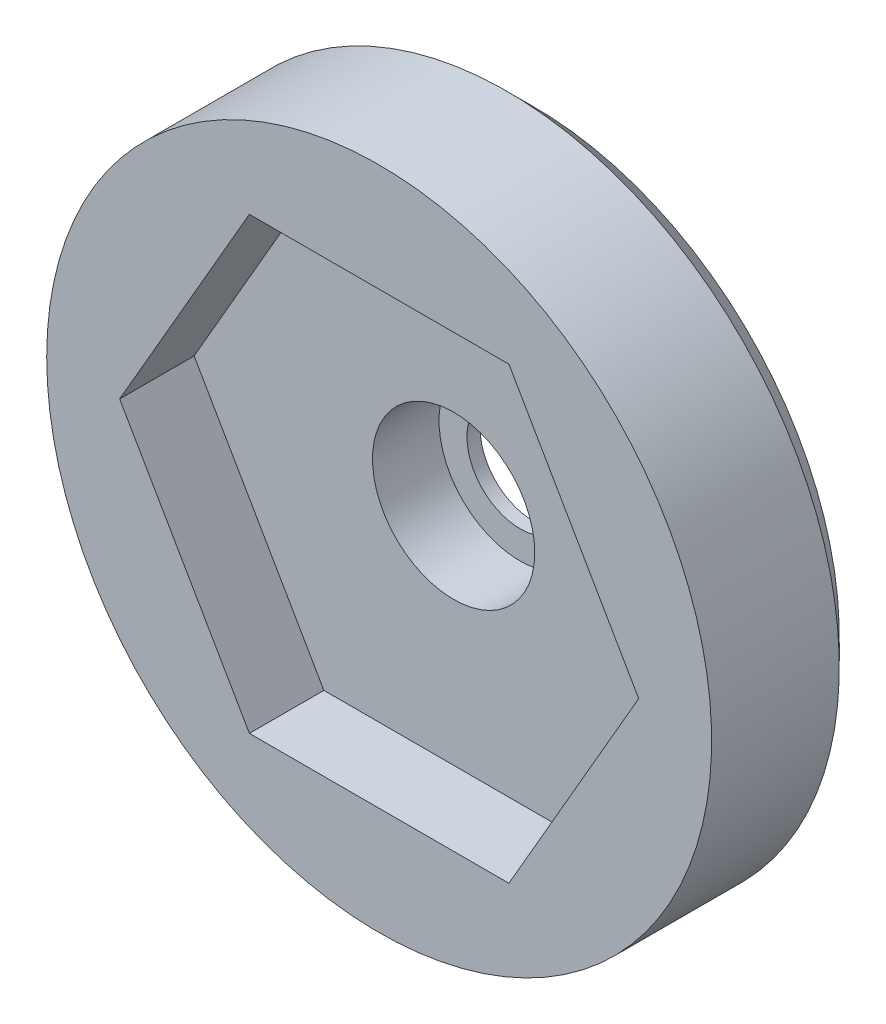
ISO-10303-21;
HEADER;
FILE_DESCRIPTION(('STEP AP214'),'2;1');
FILE_NAME('part.step','',(''),(''),'','','');
FILE_SCHEMA(('AUTOMOTIVE_DESIGN { 1 0 10303 214 1 1 1 1 }'));
ENDSEC;
DATA;
#1=APPLICATION_CONTEXT('core data for automotive mechanical design processes');
#2=APPLICATION_PROTOCOL_DEFINITION('international standard','automotive_design',2000,#1);
#3=PRODUCT_CONTEXT('',#1,'mechanical');
#4=PRODUCT('Part','Part','',(#3));
#5=PRODUCT_RELATED_PRODUCT_CATEGORY('part','',(#4));
#6=PRODUCT_DEFINITION_FORMATION('','',#4);
#7=PRODUCT_DEFINITION_CONTEXT('part definition',#1,'design');
#8=PRODUCT_DEFINITION('design','',#6,#7);
#9=PRODUCT_DEFINITION_SHAPE('','',#8);
#10=(LENGTH_UNIT() NAMED_UNIT(*) SI_UNIT(.MILLI.,.METRE.));
#11=(NAMED_UNIT(*) PLANE_ANGLE_UNIT() SI_UNIT($,.RADIAN.));
#12=(NAMED_UNIT(*) SI_UNIT($,.STERADIAN.) SOLID_ANGLE_UNIT());
#13=UNCERTAINTY_MEASURE_WITH_UNIT(LENGTH_MEASURE(1.E-05),#10,'distance_accuracy_value','');
#14=(GEOMETRIC_REPRESENTATION_CONTEXT(3) GLOBAL_UNCERTAINTY_ASSIGNED_CONTEXT((#13)) GLOBAL_UNIT_ASSIGNED_CONTEXT((#10,
#11,#12)) REPRESENTATION_CONTEXT('',''));
#15=CARTESIAN_POINT('',(0.,0.,0.));
#16=DIRECTION('',(0.,0.,1.));
#17=DIRECTION('',(1.,0.,0.));
#18=AXIS2_PLACEMENT_3D('',#15,#16,#17);
#19=CARTESIAN_POINT('',(0.,0.,-8.2));
#20=DIRECTION('',(0.,0.,1.));
#21=DIRECTION('',(1.,0.,0.));
#22=AXIS2_PLACEMENT_3D('',#19,#20,#21);
#23=PLANE('',#22);
#24=CARTESIAN_POINT('',(0.,0.,-8.2));
#25=DIRECTION('',(0.,0.,1.));
#26=DIRECTION('',(1.,0.,0.));
#27=AXIS2_PLACEMENT_3D('',#24,#25,#26);
#28=CIRCLE('',#27,12.5);
#29=CARTESIAN_POINT('',(-12.5,0.,-8.2));
#30=VERTEX_POINT('',#29);
#31=EDGE_CURVE('E11',#30,#30,#28,.T.);
#32=ORIENTED_EDGE('',*,*,#31,.T.);
#33=EDGE_LOOP('',(#32));
#34=FACE_BOUND('',#33,.T.);
#35=DIRECTION('',(0.5,-0.866025403784439,0.));
#36=VECTOR('',#35,1.);
#37=CARTESIAN_POINT('',(6.09826221831542,6.3375,-8.2));
#38=LINE('',#37,#36);
#39=CARTESIAN_POINT('',(4.87860977465233,8.45,-8.2));
#40=VERTEX_POINT('',#39);
#41=CARTESIAN_POINT('',(9.75721954930467,0.,-8.2));
#42=VERTEX_POINT('',#41);
#43=EDGE_CURVE('E27',#40,#42,#38,.T.);
#44=ORIENTED_EDGE('',*,*,#43,.T.);
#45=DIRECTION('',(-0.5,-0.866025403784438,0.));
#46=VECTOR('',#45,1.);
#47=CARTESIAN_POINT('',(8.53756710564158,-2.1125,-8.2));
#48=LINE('',#47,#46);
#49=CARTESIAN_POINT('',(4.87860977465233,-8.45,-8.2));
#50=VERTEX_POINT('',#49);
#51=EDGE_CURVE('E129',#42,#50,#48,.T.);
#52=ORIENTED_EDGE('',*,*,#51,.T.);
#53=DIRECTION('',(-1.,0.,0.));
#54=VECTOR('',#53,1.);
#55=CARTESIAN_POINT('',(2.43930488732616,-8.45,-8.2));
#56=LINE('',#55,#54);
#57=CARTESIAN_POINT('',(-4.87860977465234,-8.45,-8.2));
#58=VERTEX_POINT('',#57);
#59=EDGE_CURVE('E124',#50,#58,#56,.T.);
#60=ORIENTED_EDGE('',*,*,#59,.T.);
#61=DIRECTION('',(-0.5,0.866025403784439,0.));
#62=VECTOR('',#61,1.);
#63=CARTESIAN_POINT('',(-6.09826221831542,-6.3375,-8.2));
#64=LINE('',#63,#62);
#65=CARTESIAN_POINT('',(-9.75721954930467,0.,-8.2));
#66=VERTEX_POINT('',#65);
#67=EDGE_CURVE('E112',#58,#66,#64,.T.);
#68=ORIENTED_EDGE('',*,*,#67,.T.);
#69=DIRECTION('',(0.5,0.866025403784439,0.));
#70=VECTOR('',#69,1.);
#71=CARTESIAN_POINT('',(-8.53756710564159,2.1125,-8.2));
#72=LINE('',#71,#70);
#73=CARTESIAN_POINT('',(-4.87860977465233,8.45,-8.2));
#74=VERTEX_POINT('',#73);
#75=EDGE_CURVE('E125',#66,#74,#72,.T.);
#76=ORIENTED_EDGE('',*,*,#75,.T.);
#77=DIRECTION('',(1.,0.,0.));
#78=VECTOR('',#77,1.);
#79=CARTESIAN_POINT('',(-2.43930488732617,8.45,-8.2));
#80=LINE('',#79,#78);
#81=EDGE_CURVE('E146',#74,#40,#80,.T.);
#82=ORIENTED_EDGE('',*,*,#81,.T.);
#83=EDGE_LOOP('',(#44,#52,#60,#68,#76,#82));
#84=FACE_BOUND('',#83,.T.);
#85=ADVANCED_FACE('F16',(#34,#84),#23,.T.);
#86=CARTESIAN_POINT('',(-4.87860977465234,-8.45,-11.));
#87=DIRECTION('',(0.866025403784439,0.5,0.));
#88=DIRECTION('',(0.,0.,-1.));
#89=AXIS2_PLACEMENT_3D('',#86,#87,#88);
#90=PLANE('',#89);
#91=DIRECTION('',(0.,0.,1.));
#92=VECTOR('',#91,1.);
#93=CARTESIAN_POINT('',(-4.87860977465234,-8.45,-11.));
#94=LINE('',#93,#92);
#95=CARTESIAN_POINT('',(-4.87860977465234,-8.45,-11.));
#96=VERTEX_POINT('',#95);
#97=EDGE_CURVE('E117',#96,#58,#94,.T.);
#98=ORIENTED_EDGE('',*,*,#97,.F.);
#99=DIRECTION('',(0.5,-0.866025403784439,0.));
#100=VECTOR('',#99,1.);
#101=CARTESIAN_POINT('',(-6.09826221831542,-6.3375,-11.));
#102=LINE('',#101,#100);
#103=CARTESIAN_POINT('',(-9.75721954930467,0.,-11.));
#104=VERTEX_POINT('',#103);
#105=EDGE_CURVE('E171',#104,#96,#102,.T.);
#106=ORIENTED_EDGE('',*,*,#105,.F.);
#107=DIRECTION('',(0.,0.,1.));
#108=VECTOR('',#107,1.);
#109=CARTESIAN_POINT('',(-9.75721954930467,0.,-11.));
#110=LINE('',#109,#108);
#111=EDGE_CURVE('E120',#104,#66,#110,.T.);
#112=ORIENTED_EDGE('',*,*,#111,.T.);
#113=ORIENTED_EDGE('',*,*,#67,.F.);
#114=EDGE_LOOP('',(#98,#106,#112,#113));
#115=FACE_BOUND('',#114,.T.);
#116=ADVANCED_FACE('F114',(#115),#90,.T.);
#117=CARTESIAN_POINT('',(4.87860977465233,-8.45,-11.));
#118=DIRECTION('',(0.,1.,0.));
#119=DIRECTION('',(1.,0.,0.));
#120=AXIS2_PLACEMENT_3D('',#117,#118,#119);
#121=PLANE('',#120);
#122=DIRECTION('',(0.,0.,1.));
#123=VECTOR('',#122,1.);
#124=CARTESIAN_POINT('',(4.87860977465233,-8.45,-11.));
#125=LINE('',#124,#123);
#126=CARTESIAN_POINT('',(4.87860977465233,-8.45,-11.));
#127=VERTEX_POINT('',#126);
#128=EDGE_CURVE('E139',#127,#50,#125,.T.);
#129=ORIENTED_EDGE('',*,*,#128,.F.);
#130=DIRECTION('',(1.,0.,0.));
#131=VECTOR('',#130,1.);
#132=CARTESIAN_POINT('',(2.43930488732616,-8.45,-11.));
#133=LINE('',#132,#131);
#134=EDGE_CURVE('E137',#96,#127,#133,.T.);
#135=ORIENTED_EDGE('',*,*,#134,.F.);
#136=ORIENTED_EDGE('',*,*,#97,.T.);
#137=ORIENTED_EDGE('',*,*,#59,.F.);
#138=EDGE_LOOP('',(#129,#135,#136,#137));
#139=FACE_BOUND('',#138,.T.);
#140=ADVANCED_FACE('F135',(#139),#121,.T.);
#141=CARTESIAN_POINT('',(9.75721954930467,0.,-11.));
#142=DIRECTION('',(-0.866025403784438,0.5,0.));
#143=DIRECTION('',(0.,0.,1.));
#144=AXIS2_PLACEMENT_3D('',#141,#142,#143);
#145=PLANE('',#144);
#146=DIRECTION('',(0.,0.,1.));
#147=VECTOR('',#146,1.);
#148=CARTESIAN_POINT('',(9.75721954930467,0.,-8.5));
#149=LINE('',#148,#147);
#150=CARTESIAN_POINT('',(9.75721954930467,0.,-11.));
#151=VERTEX_POINT('',#150);
#152=EDGE_CURVE('E148',#151,#42,#149,.T.);
#153=ORIENTED_EDGE('',*,*,#152,.F.);
#154=DIRECTION('',(0.5,0.866025403784438,0.));
#155=VECTOR('',#154,1.);
#156=CARTESIAN_POINT('',(8.53756710564159,-2.1125,-11.));
#157=LINE('',#156,#155);
#158=EDGE_CURVE('E155',#127,#151,#157,.T.);
#159=ORIENTED_EDGE('',*,*,#158,.F.);
#160=ORIENTED_EDGE('',*,*,#128,.T.);
#161=ORIENTED_EDGE('',*,*,#51,.F.);
#162=EDGE_LOOP('',(#153,#159,#160,#161));
#163=FACE_BOUND('',#162,.T.);
#164=ADVANCED_FACE('F256',(#163),#145,.T.);
#165=CARTESIAN_POINT('',(4.87860977465233,8.45,-11.));
#166=DIRECTION('',(-0.866025403784439,-0.5,0.));
#167=DIRECTION('',(-0.5,0.866025403784439,0.));
#168=AXIS2_PLACEMENT_3D('',#165,#166,#167);
#169=PLANE('',#168);
#170=DIRECTION('',(0.,0.,1.));
#171=VECTOR('',#170,1.);
#172=CARTESIAN_POINT('',(4.87860977465233,8.45,-11.));
#173=LINE('',#172,#171);
#174=CARTESIAN_POINT('',(4.87860977465233,8.45,-11.));
#175=VERTEX_POINT('',#174);
#176=EDGE_CURVE('E175',#175,#40,#173,.T.);
#177=ORIENTED_EDGE('',*,*,#176,.F.);
#178=DIRECTION('',(-0.5,0.866025403784439,0.));
#179=VECTOR('',#178,1.);
#180=CARTESIAN_POINT('',(6.09826221831542,6.3375,-11.));
#181=LINE('',#180,#179);
#182=EDGE_CURVE('E152',#151,#175,#181,.T.);
#183=ORIENTED_EDGE('',*,*,#182,.F.);
#184=ORIENTED_EDGE('',*,*,#152,.T.);
#185=ORIENTED_EDGE('',*,*,#43,.F.);
#186=EDGE_LOOP('',(#177,#183,#184,#185));
#187=FACE_BOUND('',#186,.T.);
#188=ADVANCED_FACE('F258',(#187),#169,.T.);
#189=CARTESIAN_POINT('',(-4.87860977465233,8.45,-11.));
#190=DIRECTION('',(0.,-1.,0.));
#191=DIRECTION('',(0.,0.,-1.));
#192=AXIS2_PLACEMENT_3D('',#189,#190,#191);
#193=PLANE('',#192);
#194=DIRECTION('',(0.,0.,1.));
#195=VECTOR('',#194,1.);
#196=CARTESIAN_POINT('',(-4.87860977465233,8.45,-11.));
#197=LINE('',#196,#195);
#198=CARTESIAN_POINT('',(-4.87860977465233,8.45,-11.));
#199=VERTEX_POINT('',#198);
#200=EDGE_CURVE('E188',#199,#74,#197,.T.);
#201=ORIENTED_EDGE('',*,*,#200,.F.);
#202=DIRECTION('',(-1.,0.,0.));
#203=VECTOR('',#202,1.);
#204=CARTESIAN_POINT('',(-2.43930488732617,8.45,-11.));
#205=LINE('',#204,#203);
#206=EDGE_CURVE('E156',#175,#199,#205,.T.);
#207=ORIENTED_EDGE('',*,*,#206,.F.);
#208=ORIENTED_EDGE('',*,*,#176,.T.);
#209=ORIENTED_EDGE('',*,*,#81,.F.);
#210=EDGE_LOOP('',(#201,#207,#208,#209));
#211=FACE_BOUND('',#210,.T.);
#212=ADVANCED_FACE('F264',(#211),#193,.T.);
#213=CARTESIAN_POINT('',(-9.75721954930467,0.,-11.));
#214=DIRECTION('',(0.866025403784439,-0.5,0.));
#215=DIRECTION('',(0.,0.,-1.));
#216=AXIS2_PLACEMENT_3D('',#213,#214,#215);
#217=PLANE('',#216);
#218=ORIENTED_EDGE('',*,*,#111,.F.);
#219=DIRECTION('',(-0.5,-0.866025403784439,0.));
#220=VECTOR('',#219,1.);
#221=CARTESIAN_POINT('',(-8.53756710564158,2.1125,-11.));
#222=LINE('',#221,#220);
#223=EDGE_CURVE('E180',#199,#104,#222,.T.);
#224=ORIENTED_EDGE('',*,*,#223,.F.);
#225=ORIENTED_EDGE('',*,*,#200,.T.);
#226=ORIENTED_EDGE('',*,*,#75,.F.);
#227=EDGE_LOOP('',(#218,#224,#225,#226));
#228=FACE_BOUND('',#227,.T.);
#229=ADVANCED_FACE('F297',(#228),#217,.T.);
#230=CARTESIAN_POINT('',(0.,0.,-11.));
#231=DIRECTION('',(0.,0.,-1.));
#232=DIRECTION('',(-1.,0.,0.));
#233=AXIS2_PLACEMENT_3D('',#230,#231,#232);
#234=CYLINDRICAL_SURFACE('',#233,3.05);
#235=CARTESIAN_POINT('',(0.,0.,-11.));
#236=DIRECTION('',(0.,0.,-1.));
#237=DIRECTION('',(-1.,0.,0.));
#238=AXIS2_PLACEMENT_3D('',#235,#236,#237);
#239=CIRCLE('',#238,3.05);
#240=CARTESIAN_POINT('',(3.05,0.,-11.));
#241=VERTEX_POINT('',#240);
#242=EDGE_CURVE('E176',#241,#241,#239,.T.);
#243=ORIENTED_EDGE('',*,*,#242,.F.);
#244=DIRECTION('',(0.,0.,-1.));
#245=VECTOR('',#244,1.);
#246=CARTESIAN_POINT('',(3.05,0.,-11.));
#247=LINE('',#246,#245);
#248=CARTESIAN_POINT('',(3.05,0.,-13.5));
#249=VERTEX_POINT('',#248);
#250=EDGE_CURVE('E195',#241,#249,#247,.T.);
#251=ORIENTED_EDGE('',*,*,#250,.T.);
#252=CARTESIAN_POINT('',(0.,0.,-13.5));
#253=DIRECTION('',(0.,0.,-1.));
#254=DIRECTION('',(-1.,0.,0.));
#255=AXIS2_PLACEMENT_3D('',#252,#253,#254);
#256=CIRCLE('',#255,3.05);
#257=EDGE_CURVE('E163',#249,#249,#256,.T.);
#258=ORIENTED_EDGE('',*,*,#257,.T.);
#259=ORIENTED_EDGE('',*,*,#250,.F.);
#260=EDGE_LOOP('',(#243,#251,#258,#259));
#261=FACE_BOUND('',#260,.T.);
#262=ADVANCED_FACE('F287',(#261),#234,.F.);
#263=CARTESIAN_POINT('',(0.,0.,-13.5));
#264=DIRECTION('',(0.,0.,1.));
#265=DIRECTION('',(1.,0.,0.));
#266=AXIS2_PLACEMENT_3D('',#263,#264,#265);
#267=CONICAL_SURFACE('',#266,12.,0.785398163397449);
#268=CARTESIAN_POINT('',(0.,0.,-13.));
#269=DIRECTION('',(0.,0.,-1.));
#270=DIRECTION('',(1.,0.,0.));
#271=AXIS2_PLACEMENT_3D('',#268,#269,#270);
#272=CIRCLE('',#271,12.5);
#273=CARTESIAN_POINT('',(-12.5,0.,-13.));
#274=VERTEX_POINT('',#273);
#275=EDGE_CURVE('E159',#274,#274,#272,.T.);
#276=ORIENTED_EDGE('',*,*,#275,.T.);
#277=DIRECTION('',(0.707106781186548,0.,-0.707106781186547));
#278=VECTOR('',#277,1.);
#279=CARTESIAN_POINT('',(-12.,0.,-13.5));
#280=LINE('',#279,#278);
#281=CARTESIAN_POINT('',(-11.5,0.,-14.));
#282=VERTEX_POINT('',#281);
#283=EDGE_CURVE('E164',#274,#282,#280,.T.);
#284=ORIENTED_EDGE('',*,*,#283,.T.);
#285=CARTESIAN_POINT('',(0.,0.,-14.));
#286=DIRECTION('',(0.,0.,1.));
#287=DIRECTION('',(1.,0.,0.));
#288=AXIS2_PLACEMENT_3D('',#285,#286,#287);
#289=CIRCLE('',#288,11.5);
#290=EDGE_CURVE('E165',#282,#282,#289,.T.);
#291=ORIENTED_EDGE('',*,*,#290,.T.);
#292=ORIENTED_EDGE('',*,*,#283,.F.);
#293=EDGE_LOOP('',(#276,#284,#291,#292));
#294=FACE_BOUND('',#293,.T.);
#295=ADVANCED_FACE('F228',(#294),#267,.T.);
#296=CARTESIAN_POINT('',(0.,0.,-14.));
#297=DIRECTION('',(0.,0.,1.));
#298=DIRECTION('',(1.,0.,0.));
#299=AXIS2_PLACEMENT_3D('',#296,#297,#298);
#300=PLANE('',#299);
#301=ORIENTED_EDGE('',*,*,#290,.F.);
#302=EDGE_LOOP('',(#301));
#303=FACE_BOUND('',#302,.T.);
#304=CARTESIAN_POINT('',(0.,0.,-14.));
#305=DIRECTION('',(0.,0.,1.));
#306=DIRECTION('',(1.,0.,0.));
#307=AXIS2_PLACEMENT_3D('',#304,#305,#306);
#308=CIRCLE('',#307,2.);
#309=CARTESIAN_POINT('',(-2.,0.,-14.));
#310=VERTEX_POINT('',#309);
#311=EDGE_CURVE('E84',#310,#310,#308,.T.);
#312=ORIENTED_EDGE('',*,*,#311,.T.);
#313=EDGE_LOOP('',(#312));
#314=FACE_BOUND('',#313,.T.);
#315=ADVANCED_FACE('F18',(#303,#314),#300,.F.);
#316=CARTESIAN_POINT('',(0.,0.,-11.));
#317=DIRECTION('',(0.,0.,1.));
#318=DIRECTION('',(1.,0.,0.));
#319=AXIS2_PLACEMENT_3D('',#316,#317,#318);
#320=CYLINDRICAL_SURFACE('',#319,12.5);
#321=ORIENTED_EDGE('',*,*,#31,.F.);
#322=DIRECTION('',(0.,0.,-1.));
#323=VECTOR('',#322,1.);
#324=CARTESIAN_POINT('',(-12.5,0.,-11.));
#325=LINE('',#324,#323);
#326=EDGE_CURVE('E184',#30,#274,#325,.T.);
#327=ORIENTED_EDGE('',*,*,#326,.T.);
#328=ORIENTED_EDGE('',*,*,#275,.F.);
#329=ORIENTED_EDGE('',*,*,#326,.F.);
#330=EDGE_LOOP('',(#321,#327,#328,#329));
#331=FACE_BOUND('',#330,.T.);
#332=ADVANCED_FACE('F230',(#331),#320,.T.);
#333=CARTESIAN_POINT('',(0.,0.,-13.5));
#334=DIRECTION('',(0.,0.,-1.));
#335=DIRECTION('',(0.,-1.,0.));
#336=AXIS2_PLACEMENT_3D('',#333,#334,#335);
#337=PLANE('',#336);
#338=ORIENTED_EDGE('',*,*,#257,.F.);
#339=EDGE_LOOP('',(#338));
#340=FACE_BOUND('',#339,.T.);
#341=CARTESIAN_POINT('',(0.,0.,-13.5));
#342=DIRECTION('',(0.,0.,-1.));
#343=DIRECTION('',(1.,0.,0.));
#344=AXIS2_PLACEMENT_3D('',#341,#342,#343);
#345=CIRCLE('',#344,2.);
#346=CARTESIAN_POINT('',(-2.,0.,-13.5));
#347=VERTEX_POINT('',#346);
#348=EDGE_CURVE('E91',#347,#347,#345,.T.);
#349=ORIENTED_EDGE('',*,*,#348,.T.);
#350=EDGE_LOOP('',(#349));
#351=FACE_BOUND('',#350,.T.);
#352=ADVANCED_FACE('F232',(#340,#351),#337,.F.);
#353=CARTESIAN_POINT('',(0.,0.,-12.65));
#354=DIRECTION('',(0.,0.,-1.));
#355=DIRECTION('',(1.,0.,0.));
#356=AXIS2_PLACEMENT_3D('',#353,#354,#355);
#357=CYLINDRICAL_SURFACE('',#356,2.);
#358=ORIENTED_EDGE('',*,*,#348,.F.);
#359=DIRECTION('',(0.,0.,-1.));
#360=VECTOR('',#359,1.);
#361=CARTESIAN_POINT('',(-2.,0.,-12.65));
#362=LINE('',#361,#360);
#363=EDGE_CURVE('E20',#347,#310,#362,.T.);
#364=ORIENTED_EDGE('',*,*,#363,.T.);
#365=ORIENTED_EDGE('',*,*,#311,.F.);
#366=ORIENTED_EDGE('',*,*,#363,.F.);
#367=EDGE_LOOP('',(#358,#364,#365,#366));
#368=FACE_BOUND('',#367,.T.);
#369=ADVANCED_FACE('F240',(#368),#357,.F.);
#370=CARTESIAN_POINT('',(0.,0.,-11.));
#371=DIRECTION('',(0.,0.,1.));
#372=DIRECTION('',(1.,0.,0.));
#373=AXIS2_PLACEMENT_3D('',#370,#371,#372);
#374=PLANE('',#373);
#375=ORIENTED_EDGE('',*,*,#105,.T.);
#376=ORIENTED_EDGE('',*,*,#134,.T.);
#377=ORIENTED_EDGE('',*,*,#158,.T.);
#378=ORIENTED_EDGE('',*,*,#182,.T.);
#379=ORIENTED_EDGE('',*,*,#206,.T.);
#380=ORIENTED_EDGE('',*,*,#223,.T.);
#381=EDGE_LOOP('',(#375,#376,#377,#378,#379,#380));
#382=FACE_BOUND('',#381,.T.);
#383=ORIENTED_EDGE('',*,*,#242,.T.);
#384=EDGE_LOOP('',(#383));
#385=FACE_BOUND('',#384,.T.);
#386=ADVANCED_FACE('F272',(#382,#385),#374,.T.);
#387=CLOSED_SHELL('',(#85,#116,#140,#164,#188,#212,#229,#262,#295,#315,#332,#352,#369,#386));
#388=MANIFOLD_SOLID_BREP('B1',#387);
#389=ADVANCED_BREP_SHAPE_REPRESENTATION('',(#18,#388),#14);
#390=SHAPE_DEFINITION_REPRESENTATION(#9,#389);
ENDSEC;
END-ISO-10303-21;
